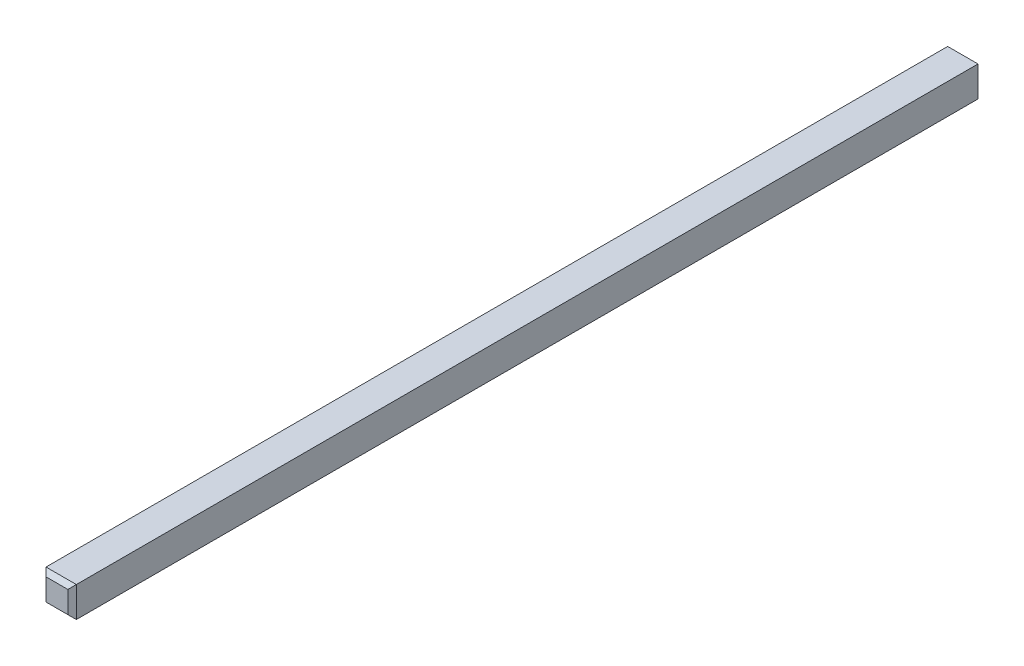
ISO-10303-21;
HEADER;
FILE_DESCRIPTION(('STEP AP214'),'2;1');
FILE_NAME('part.step','',(''),(''),'','','');
FILE_SCHEMA(('AUTOMOTIVE_DESIGN { 1 0 10303 214 1 1 1 1 }'));
ENDSEC;
DATA;
#1=APPLICATION_CONTEXT('core data for automotive mechanical design processes');
#2=APPLICATION_PROTOCOL_DEFINITION('international standard','automotive_design',2000,#1);
#3=PRODUCT_CONTEXT('',#1,'mechanical');
#4=PRODUCT('Part','Part','',(#3));
#5=PRODUCT_RELATED_PRODUCT_CATEGORY('part','',(#4));
#6=PRODUCT_DEFINITION_FORMATION('','',#4);
#7=PRODUCT_DEFINITION_CONTEXT('part definition',#1,'design');
#8=PRODUCT_DEFINITION('design','',#6,#7);
#9=PRODUCT_DEFINITION_SHAPE('','',#8);
#10=(LENGTH_UNIT() NAMED_UNIT(*) SI_UNIT(.MILLI.,.METRE.));
#11=(NAMED_UNIT(*) PLANE_ANGLE_UNIT() SI_UNIT($,.RADIAN.));
#12=(NAMED_UNIT(*) SI_UNIT($,.STERADIAN.) SOLID_ANGLE_UNIT());
#13=UNCERTAINTY_MEASURE_WITH_UNIT(LENGTH_MEASURE(1.E-05),#10,'distance_accuracy_value','');
#14=(GEOMETRIC_REPRESENTATION_CONTEXT(3) GLOBAL_UNCERTAINTY_ASSIGNED_CONTEXT((#13)) GLOBAL_UNIT_ASSIGNED_CONTEXT((#10,
#11,#12)) REPRESENTATION_CONTEXT('',''));
#15=CARTESIAN_POINT('',(0.,0.,0.));
#16=DIRECTION('',(0.,0.,1.));
#17=DIRECTION('',(1.,0.,0.));
#18=AXIS2_PLACEMENT_3D('',#15,#16,#17);
#19=CARTESIAN_POINT('',(0.,0.,15.));
#20=DIRECTION('',(1.,0.,0.));
#21=DIRECTION('',(0.,1.,0.));
#22=AXIS2_PLACEMENT_3D('',#19,#20,#21);
#23=PLANE('',#22);
#24=DIRECTION('',(0.,0.,-1.));
#25=VECTOR('',#24,1.);
#26=CARTESIAN_POINT('',(0.,0.,15.));
#27=LINE('',#26,#25);
#28=CARTESIAN_POINT('',(0.,0.,14.93));
#29=VERTEX_POINT('',#28);
#30=CARTESIAN_POINT('',(0.,0.,0.0700000000000006));
#31=VERTEX_POINT('',#30);
#32=EDGE_CURVE('E11',#29,#31,#27,.T.);
#33=ORIENTED_EDGE('',*,*,#32,.T.);
#34=DIRECTION('',(0.,-1.,0.));
#35=VECTOR('',#34,1.);
#36=CARTESIAN_POINT('',(0.,0.,0.0700000000000006));
#37=LINE('',#36,#35);
#38=CARTESIAN_POINT('',(0.,-0.5,0.0700000000000006));
#39=VERTEX_POINT('',#38);
#40=EDGE_CURVE('E23',#31,#39,#37,.T.);
#41=ORIENTED_EDGE('',*,*,#40,.T.);
#42=DIRECTION('',(0.,0.,-1.));
#43=VECTOR('',#42,1.);
#44=CARTESIAN_POINT('',(0.,-0.5,15.));
#45=LINE('',#44,#43);
#46=CARTESIAN_POINT('',(0.,-0.5,14.93));
#47=VERTEX_POINT('',#46);
#48=EDGE_CURVE('E140',#47,#39,#45,.T.);
#49=ORIENTED_EDGE('',*,*,#48,.F.);
#50=DIRECTION('',(0.,1.,0.));
#51=VECTOR('',#50,1.);
#52=CARTESIAN_POINT('',(0.,0.,14.93));
#53=LINE('',#52,#51);
#54=EDGE_CURVE('E138',#47,#29,#53,.T.);
#55=ORIENTED_EDGE('',*,*,#54,.T.);
#56=EDGE_LOOP('',(#33,#41,#49,#55));
#57=FACE_BOUND('',#56,.T.);
#58=ADVANCED_FACE('F16',(#57),#23,.F.);
#59=CARTESIAN_POINT('',(0.,-0.5,15.));
#60=DIRECTION('',(0.,1.,0.));
#61=DIRECTION('',(0.,0.,1.));
#62=AXIS2_PLACEMENT_3D('',#59,#60,#61);
#63=PLANE('',#62);
#64=ORIENTED_EDGE('',*,*,#48,.T.);
#65=DIRECTION('',(1.,0.,0.));
#66=VECTOR('',#65,1.);
#67=CARTESIAN_POINT('',(0.,-0.5,0.0700000000000006));
#68=LINE('',#67,#66);
#69=CARTESIAN_POINT('',(0.5,-0.5,0.0700000000000006));
#70=VERTEX_POINT('',#69);
#71=EDGE_CURVE('E136',#39,#70,#68,.T.);
#72=ORIENTED_EDGE('',*,*,#71,.T.);
#73=DIRECTION('',(0.,0.,-1.));
#74=VECTOR('',#73,1.);
#75=CARTESIAN_POINT('',(0.5,-0.5,15.));
#76=LINE('',#75,#74);
#77=CARTESIAN_POINT('',(0.5,-0.5,14.93));
#78=VERTEX_POINT('',#77);
#79=EDGE_CURVE('E133',#78,#70,#76,.T.);
#80=ORIENTED_EDGE('',*,*,#79,.F.);
#81=DIRECTION('',(-1.,0.,0.));
#82=VECTOR('',#81,1.);
#83=CARTESIAN_POINT('',(0.,-0.5,14.93));
#84=LINE('',#83,#82);
#85=EDGE_CURVE('E130',#78,#47,#84,.T.);
#86=ORIENTED_EDGE('',*,*,#85,.T.);
#87=EDGE_LOOP('',(#64,#72,#80,#86));
#88=FACE_BOUND('',#87,.T.);
#89=ADVANCED_FACE('F146',(#88),#63,.F.);
#90=CARTESIAN_POINT('',(0.5,0.,15.));
#91=DIRECTION('',(-1.,0.,0.));
#92=DIRECTION('',(0.,0.,1.));
#93=AXIS2_PLACEMENT_3D('',#90,#91,#92);
#94=PLANE('',#93);
#95=ORIENTED_EDGE('',*,*,#79,.T.);
#96=DIRECTION('',(0.,1.,0.));
#97=VECTOR('',#96,1.);
#98=CARTESIAN_POINT('',(0.5,0.,0.0700000000000006));
#99=LINE('',#98,#97);
#100=CARTESIAN_POINT('',(0.5,0.,0.0700000000000006));
#101=VERTEX_POINT('',#100);
#102=EDGE_CURVE('E99',#70,#101,#99,.T.);
#103=ORIENTED_EDGE('',*,*,#102,.T.);
#104=DIRECTION('',(0.,0.,-1.));
#105=VECTOR('',#104,1.);
#106=CARTESIAN_POINT('',(0.5,0.,15.));
#107=LINE('',#106,#105);
#108=CARTESIAN_POINT('',(0.5,0.,14.93));
#109=VERTEX_POINT('',#108);
#110=EDGE_CURVE('E126',#109,#101,#107,.T.);
#111=ORIENTED_EDGE('',*,*,#110,.F.);
#112=DIRECTION('',(0.,-1.,0.));
#113=VECTOR('',#112,1.);
#114=CARTESIAN_POINT('',(0.5,-0.5,14.93));
#115=LINE('',#114,#113);
#116=EDGE_CURVE('E123',#109,#78,#115,.T.);
#117=ORIENTED_EDGE('',*,*,#116,.T.);
#118=EDGE_LOOP('',(#95,#103,#111,#117));
#119=FACE_BOUND('',#118,.T.);
#120=ADVANCED_FACE('F159',(#119),#94,.F.);
#121=CARTESIAN_POINT('',(0.,0.,15.));
#122=DIRECTION('',(0.,-1.,0.));
#123=DIRECTION('',(0.,0.,-1.));
#124=AXIS2_PLACEMENT_3D('',#121,#122,#123);
#125=PLANE('',#124);
#126=ORIENTED_EDGE('',*,*,#110,.T.);
#127=DIRECTION('',(-1.,0.,0.));
#128=VECTOR('',#127,1.);
#129=CARTESIAN_POINT('',(0.,0.,0.0700000000000006));
#130=LINE('',#129,#128);
#131=EDGE_CURVE('E121',#101,#31,#130,.T.);
#132=ORIENTED_EDGE('',*,*,#131,.T.);
#133=ORIENTED_EDGE('',*,*,#32,.F.);
#134=DIRECTION('',(1.,0.,0.));
#135=VECTOR('',#134,1.);
#136=CARTESIAN_POINT('',(0.5,0.,14.93));
#137=LINE('',#136,#135);
#138=EDGE_CURVE('E119',#29,#109,#137,.T.);
#139=ORIENTED_EDGE('',*,*,#138,.T.);
#140=EDGE_LOOP('',(#126,#132,#133,#139));
#141=FACE_BOUND('',#140,.T.);
#142=ADVANCED_FACE('F154',(#141),#125,.F.);
#143=CARTESIAN_POINT('',(0.,-0.5,15.));
#144=DIRECTION('',(0.,0.,1.));
#145=DIRECTION('',(1.,0.,0.));
#146=AXIS2_PLACEMENT_3D('',#143,#144,#145);
#147=PLANE('',#146);
#148=DIRECTION('',(-1.,0.,0.));
#149=VECTOR('',#148,1.);
#150=CARTESIAN_POINT('',(0.,-0.0700000000000006,15.));
#151=LINE('',#150,#149);
#152=CARTESIAN_POINT('',(0.43,-0.0700000000000006,15.));
#153=VERTEX_POINT('',#152);
#154=CARTESIAN_POINT('',(0.0700000000000006,-0.0700000000000006,15.));
#155=VERTEX_POINT('',#154);
#156=EDGE_CURVE('E117',#153,#155,#151,.T.);
#157=ORIENTED_EDGE('',*,*,#156,.T.);
#158=DIRECTION('',(0.,-1.,0.));
#159=VECTOR('',#158,1.);
#160=CARTESIAN_POINT('',(0.0700000000000007,-0.5,15.));
#161=LINE('',#160,#159);
#162=CARTESIAN_POINT('',(0.0700000000000007,-0.429999999999999,15.));
#163=VERTEX_POINT('',#162);
#164=EDGE_CURVE('E115',#155,#163,#161,.T.);
#165=ORIENTED_EDGE('',*,*,#164,.T.);
#166=DIRECTION('',(1.,0.,0.));
#167=VECTOR('',#166,1.);
#168=CARTESIAN_POINT('',(0.5,-0.429999999999999,15.));
#169=LINE('',#168,#167);
#170=CARTESIAN_POINT('',(0.43,-0.429999999999999,15.));
#171=VERTEX_POINT('',#170);
#172=EDGE_CURVE('E113',#163,#171,#169,.T.);
#173=ORIENTED_EDGE('',*,*,#172,.T.);
#174=DIRECTION('',(0.,1.,0.));
#175=VECTOR('',#174,1.);
#176=CARTESIAN_POINT('',(0.43,0.,15.));
#177=LINE('',#176,#175);
#178=EDGE_CURVE('E110',#171,#153,#177,.T.);
#179=ORIENTED_EDGE('',*,*,#178,.T.);
#180=EDGE_LOOP('',(#157,#165,#173,#179));
#181=FACE_BOUND('',#180,.T.);
#182=ADVANCED_FACE('F184',(#181),#147,.T.);
#183=CARTESIAN_POINT('',(0.,-0.5,0.));
#184=DIRECTION('',(0.,0.,1.));
#185=DIRECTION('',(1.,0.,0.));
#186=AXIS2_PLACEMENT_3D('',#183,#184,#185);
#187=PLANE('',#186);
#188=DIRECTION('',(0.,1.,0.));
#189=VECTOR('',#188,1.);
#190=CARTESIAN_POINT('',(0.0700000000000007,-0.5,0.));
#191=LINE('',#190,#189);
#192=CARTESIAN_POINT('',(0.0700000000000007,-0.429999999999999,0.));
#193=VERTEX_POINT('',#192);
#194=CARTESIAN_POINT('',(0.0700000000000006,-0.0700000000000006,0.));
#195=VERTEX_POINT('',#194);
#196=EDGE_CURVE('E108',#193,#195,#191,.T.);
#197=ORIENTED_EDGE('',*,*,#196,.T.);
#198=DIRECTION('',(1.,0.,0.));
#199=VECTOR('',#198,1.);
#200=CARTESIAN_POINT('',(0.,-0.0700000000000006,0.));
#201=LINE('',#200,#199);
#202=CARTESIAN_POINT('',(0.43,-0.0700000000000006,0.));
#203=VERTEX_POINT('',#202);
#204=EDGE_CURVE('E83',#195,#203,#201,.T.);
#205=ORIENTED_EDGE('',*,*,#204,.T.);
#206=DIRECTION('',(0.,-1.,0.));
#207=VECTOR('',#206,1.);
#208=CARTESIAN_POINT('',(0.43,-0.5,0.));
#209=LINE('',#208,#207);
#210=CARTESIAN_POINT('',(0.43,-0.429999999999999,0.));
#211=VERTEX_POINT('',#210);
#212=EDGE_CURVE('E77',#203,#211,#209,.T.);
#213=ORIENTED_EDGE('',*,*,#212,.T.);
#214=DIRECTION('',(-1.,0.,0.));
#215=VECTOR('',#214,1.);
#216=CARTESIAN_POINT('',(0.,-0.429999999999999,0.));
#217=LINE('',#216,#215);
#218=EDGE_CURVE('E80',#211,#193,#217,.T.);
#219=ORIENTED_EDGE('',*,*,#218,.T.);
#220=EDGE_LOOP('',(#197,#205,#213,#219));
#221=FACE_BOUND('',#220,.T.);
#222=ADVANCED_FACE('F79',(#221),#187,.F.);
#223=CARTESIAN_POINT('',(0.,-0.5,0.0700000000000006));
#224=DIRECTION('',(0.,0.707106781186548,0.707106781186548));
#225=DIRECTION('',(0.,-0.707106781186548,0.707106781186548));
#226=AXIS2_PLACEMENT_3D('',#223,#224,#225);
#227=PLANE('',#226);
#228=DIRECTION('',(-0.577350269189626,-0.577350269189626,0.577350269189626));
#229=VECTOR('',#228,1.);
#230=CARTESIAN_POINT('',(0.,-0.5,0.0700000000000006));
#231=LINE('',#230,#229);
#232=EDGE_CURVE('E95',#193,#39,#231,.T.);
#233=ORIENTED_EDGE('',*,*,#232,.F.);
#234=ORIENTED_EDGE('',*,*,#218,.F.);
#235=DIRECTION('',(-0.577350269189626,0.577350269189626,-0.577350269189626));
#236=VECTOR('',#235,1.);
#237=CARTESIAN_POINT('',(0.333333333333334,-0.333333333333333,-0.096666666666666));
#238=LINE('',#237,#236);
#239=EDGE_CURVE('E93',#70,#211,#238,.T.);
#240=ORIENTED_EDGE('',*,*,#239,.F.);
#241=ORIENTED_EDGE('',*,*,#71,.F.);
#242=EDGE_LOOP('',(#233,#234,#240,#241));
#243=FACE_BOUND('',#242,.T.);
#244=ADVANCED_FACE('F91',(#243),#227,.F.);
#245=CARTESIAN_POINT('',(0.5,0.,0.0700000000000006));
#246=DIRECTION('',(-0.707106781186548,0.,0.707106781186548));
#247=DIRECTION('',(0.707106781186548,0.,0.707106781186548));
#248=AXIS2_PLACEMENT_3D('',#245,#246,#247);
#249=PLANE('',#248);
#250=ORIENTED_EDGE('',*,*,#239,.T.);
#251=ORIENTED_EDGE('',*,*,#212,.F.);
#252=DIRECTION('',(-0.577350269189626,-0.577350269189626,-0.577350269189626));
#253=VECTOR('',#252,1.);
#254=CARTESIAN_POINT('',(0.5,0.,0.0700000000000006));
#255=LINE('',#254,#253);
#256=EDGE_CURVE('E100',#101,#203,#255,.T.);
#257=ORIENTED_EDGE('',*,*,#256,.F.);
#258=ORIENTED_EDGE('',*,*,#102,.F.);
#259=EDGE_LOOP('',(#250,#251,#257,#258));
#260=FACE_BOUND('',#259,.T.);
#261=ADVANCED_FACE('F98',(#260),#249,.F.);
#262=CARTESIAN_POINT('',(0.,0.,0.0700000000000006));
#263=DIRECTION('',(0.707106781186548,0.,0.707106781186548));
#264=DIRECTION('',(0.707106781186548,0.,-0.707106781186548));
#265=AXIS2_PLACEMENT_3D('',#262,#263,#264);
#266=PLANE('',#265);
#267=ORIENTED_EDGE('',*,*,#232,.T.);
#268=ORIENTED_EDGE('',*,*,#40,.F.);
#269=DIRECTION('',(-0.577350269189626,0.577350269189626,0.577350269189626));
#270=VECTOR('',#269,1.);
#271=CARTESIAN_POINT('',(0.,0.,0.0700000000000006));
#272=LINE('',#271,#270);
#273=EDGE_CURVE('E103',#195,#31,#272,.T.);
#274=ORIENTED_EDGE('',*,*,#273,.F.);
#275=ORIENTED_EDGE('',*,*,#196,.F.);
#276=EDGE_LOOP('',(#267,#268,#274,#275));
#277=FACE_BOUND('',#276,.T.);
#278=ADVANCED_FACE('F149',(#277),#266,.F.);
#279=CARTESIAN_POINT('',(0.,0.,0.0700000000000006));
#280=DIRECTION('',(0.,-0.707106781186548,0.707106781186548));
#281=DIRECTION('',(0.,-0.707106781186548,-0.707106781186548));
#282=AXIS2_PLACEMENT_3D('',#279,#280,#281);
#283=PLANE('',#282);
#284=ORIENTED_EDGE('',*,*,#256,.T.);
#285=ORIENTED_EDGE('',*,*,#204,.F.);
#286=ORIENTED_EDGE('',*,*,#273,.T.);
#287=ORIENTED_EDGE('',*,*,#131,.F.);
#288=EDGE_LOOP('',(#284,#285,#286,#287));
#289=FACE_BOUND('',#288,.T.);
#290=ADVANCED_FACE('F152',(#289),#283,.F.);
#291=CARTESIAN_POINT('',(0.43,-0.5,15.));
#292=DIRECTION('',(0.707106781186548,0.,0.707106781186548));
#293=DIRECTION('',(0.707106781186548,0.,-0.707106781186548));
#294=AXIS2_PLACEMENT_3D('',#291,#292,#293);
#295=PLANE('',#294);
#296=DIRECTION('',(-0.577350269189626,0.577350269189626,0.577350269189626));
#297=VECTOR('',#296,1.);
#298=CARTESIAN_POINT('',(0.453333333333333,-0.453333333333333,14.9766666666667));
#299=LINE('',#298,#297);
#300=EDGE_CURVE('E167',#78,#171,#299,.T.);
#301=ORIENTED_EDGE('',*,*,#300,.F.);
#302=ORIENTED_EDGE('',*,*,#116,.F.);
#303=DIRECTION('',(0.577350269189626,0.577350269189626,-0.577350269189626));
#304=VECTOR('',#303,1.);
#305=CARTESIAN_POINT('',(0.286666666666667,-0.213333333333334,15.1433333333333));
#306=LINE('',#305,#304);
#307=EDGE_CURVE('E165',#153,#109,#306,.T.);
#308=ORIENTED_EDGE('',*,*,#307,.F.);
#309=ORIENTED_EDGE('',*,*,#178,.F.);
#310=EDGE_LOOP('',(#301,#302,#308,#309));
#311=FACE_BOUND('',#310,.T.);
#312=ADVANCED_FACE('F163',(#311),#295,.T.);
#313=CARTESIAN_POINT('',(0.,-0.0700000000000006,15.));
#314=DIRECTION('',(0.,0.707106781186548,0.707106781186548));
#315=DIRECTION('',(0.,-0.707106781186548,0.707106781186548));
#316=AXIS2_PLACEMENT_3D('',#313,#314,#315);
#317=PLANE('',#316);
#318=ORIENTED_EDGE('',*,*,#307,.T.);
#319=ORIENTED_EDGE('',*,*,#138,.F.);
#320=DIRECTION('',(-0.577350269189626,0.577350269189626,-0.577350269189626));
#321=VECTOR('',#320,1.);
#322=CARTESIAN_POINT('',(0.0466666666666671,-0.0466666666666671,14.9766666666667));
#323=LINE('',#322,#321);
#324=EDGE_CURVE('E171',#155,#29,#323,.T.);
#325=ORIENTED_EDGE('',*,*,#324,.F.);
#326=ORIENTED_EDGE('',*,*,#156,.F.);
#327=EDGE_LOOP('',(#318,#319,#325,#326));
#328=FACE_BOUND('',#327,.T.);
#329=ADVANCED_FACE('F186',(#328),#317,.T.);
#330=CARTESIAN_POINT('',(0.,-0.429999999999999,15.));
#331=DIRECTION('',(0.,-0.707106781186548,0.707106781186548));
#332=DIRECTION('',(0.,-0.707106781186548,-0.707106781186548));
#333=AXIS2_PLACEMENT_3D('',#330,#331,#332);
#334=PLANE('',#333);
#335=ORIENTED_EDGE('',*,*,#300,.T.);
#336=ORIENTED_EDGE('',*,*,#172,.F.);
#337=DIRECTION('',(0.577350269189626,0.577350269189626,0.577350269189626));
#338=VECTOR('',#337,1.);
#339=CARTESIAN_POINT('',(0.0466666666666672,-0.453333333333333,14.9766666666667));
#340=LINE('',#339,#338);
#341=EDGE_CURVE('E176',#47,#163,#340,.T.);
#342=ORIENTED_EDGE('',*,*,#341,.F.);
#343=ORIENTED_EDGE('',*,*,#85,.F.);
#344=EDGE_LOOP('',(#335,#336,#342,#343));
#345=FACE_BOUND('',#344,.T.);
#346=ADVANCED_FACE('F182',(#345),#334,.T.);
#347=CARTESIAN_POINT('',(0.0700000000000007,-0.5,15.));
#348=DIRECTION('',(-0.707106781186548,0.,0.707106781186548));
#349=DIRECTION('',(0.707106781186548,0.,0.707106781186548));
#350=AXIS2_PLACEMENT_3D('',#347,#348,#349);
#351=PLANE('',#350);
#352=ORIENTED_EDGE('',*,*,#324,.T.);
#353=ORIENTED_EDGE('',*,*,#54,.F.);
#354=ORIENTED_EDGE('',*,*,#341,.T.);
#355=ORIENTED_EDGE('',*,*,#164,.F.);
#356=EDGE_LOOP('',(#352,#353,#354,#355));
#357=FACE_BOUND('',#356,.T.);
#358=ADVANCED_FACE('F180',(#357),#351,.T.);
#359=CLOSED_SHELL('',(#58,#89,#120,#142,#182,#222,#244,#261,#278,#290,#312,#329,#346,#358));
#360=MANIFOLD_SOLID_BREP('B1',#359);
#361=ADVANCED_BREP_SHAPE_REPRESENTATION('',(#18,#360),#14);
#362=SHAPE_DEFINITION_REPRESENTATION(#9,#361);
ENDSEC;
END-ISO-10303-21;
